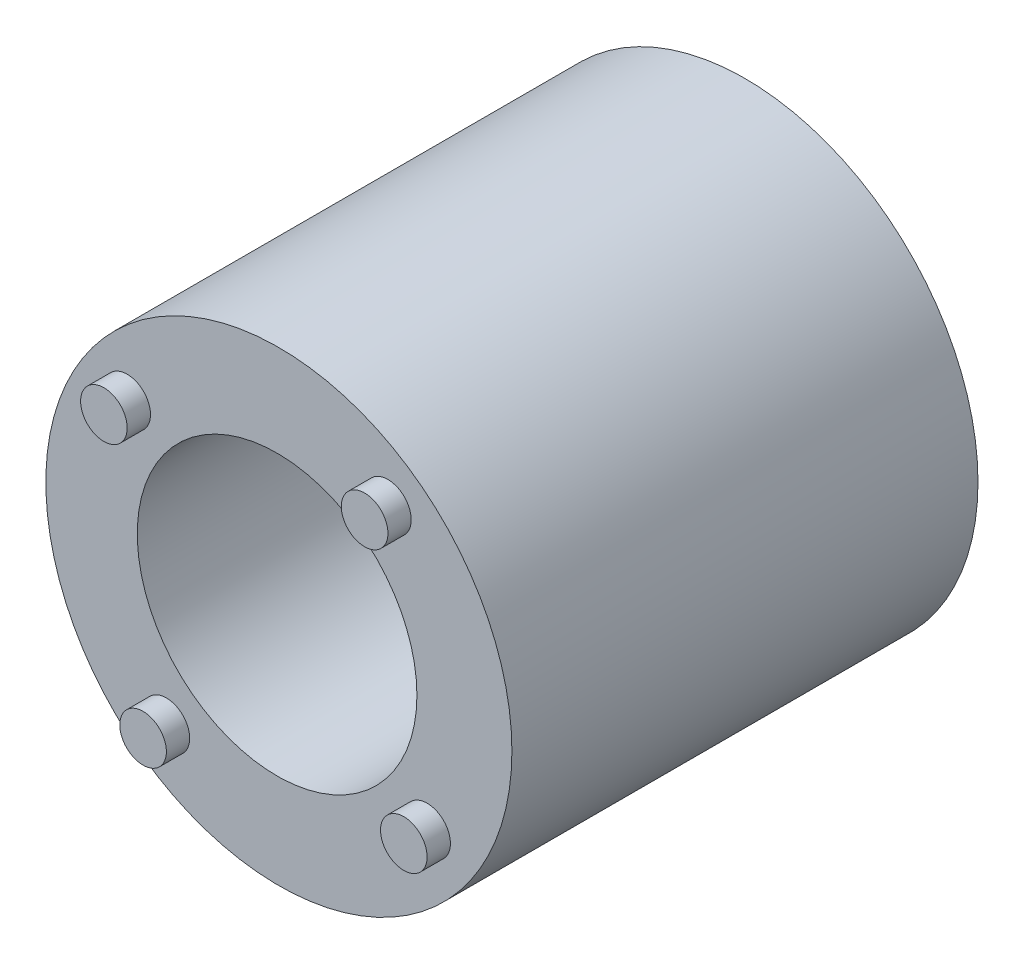
ISO-10303-21;
HEADER;
FILE_DESCRIPTION(('STEP AP214'),'2;1');
FILE_NAME('part.step','',(''),(''),'','','');
FILE_SCHEMA(('AUTOMOTIVE_DESIGN { 1 0 10303 214 1 1 1 1 }'));
ENDSEC;
DATA;
#1=APPLICATION_CONTEXT('core data for automotive mechanical design processes');
#2=APPLICATION_PROTOCOL_DEFINITION('international standard','automotive_design',2000,#1);
#3=PRODUCT_CONTEXT('',#1,'mechanical');
#4=PRODUCT('Part','Part','',(#3));
#5=PRODUCT_RELATED_PRODUCT_CATEGORY('part','',(#4));
#6=PRODUCT_DEFINITION_FORMATION('','',#4);
#7=PRODUCT_DEFINITION_CONTEXT('part definition',#1,'design');
#8=PRODUCT_DEFINITION('design','',#6,#7);
#9=PRODUCT_DEFINITION_SHAPE('','',#8);
#10=(LENGTH_UNIT() NAMED_UNIT(*) SI_UNIT(.MILLI.,.METRE.));
#11=(NAMED_UNIT(*) PLANE_ANGLE_UNIT() SI_UNIT($,.RADIAN.));
#12=(NAMED_UNIT(*) SI_UNIT($,.STERADIAN.) SOLID_ANGLE_UNIT());
#13=UNCERTAINTY_MEASURE_WITH_UNIT(LENGTH_MEASURE(1.E-05),#10,'distance_accuracy_value','');
#14=(GEOMETRIC_REPRESENTATION_CONTEXT(3) GLOBAL_UNCERTAINTY_ASSIGNED_CONTEXT((#13)) GLOBAL_UNIT_ASSIGNED_CONTEXT((#10,
#11,#12)) REPRESENTATION_CONTEXT('',''));
#15=CARTESIAN_POINT('',(0.,0.,0.));
#16=DIRECTION('',(0.,0.,1.));
#17=DIRECTION('',(1.,0.,0.));
#18=AXIS2_PLACEMENT_3D('',#15,#16,#17);
#19=CARTESIAN_POINT('',(0.369408827853465,0.,100.));
#20=DIRECTION('',(0.,0.,-1.));
#21=DIRECTION('',(-1.,0.,0.));
#22=AXIS2_PLACEMENT_3D('',#19,#20,#21);
#23=CYLINDRICAL_SURFACE('',#22,50.);
#24=CARTESIAN_POINT('',(0.369408827853465,0.,100.));
#25=DIRECTION('',(0.,0.,1.));
#26=DIRECTION('',(1.,0.,0.));
#27=AXIS2_PLACEMENT_3D('',#24,#25,#26);
#28=CIRCLE('',#27,50.);
#29=CARTESIAN_POINT('',(50.3694088278535,0.,100.));
#30=VERTEX_POINT('',#29);
#31=EDGE_CURVE('E107',#30,#30,#28,.T.);
#32=ORIENTED_EDGE('',*,*,#31,.F.);
#33=EDGE_LOOP('',(#32));
#34=FACE_BOUND('',#33,.T.);
#35=CARTESIAN_POINT('',(0.369408827853465,0.,0.));
#36=DIRECTION('',(0.,0.,1.));
#37=DIRECTION('',(1.,0.,0.));
#38=AXIS2_PLACEMENT_3D('',#35,#36,#37);
#39=CIRCLE('',#38,50.);
#40=CARTESIAN_POINT('',(50.3694088278535,0.,0.));
#41=VERTEX_POINT('',#40);
#42=EDGE_CURVE('E101',#41,#41,#39,.T.);
#43=ORIENTED_EDGE('',*,*,#42,.T.);
#44=EDGE_LOOP('',(#43));
#45=FACE_BOUND('',#44,.T.);
#46=ADVANCED_FACE('F45',(#34,#45),#23,.T.);
#47=CARTESIAN_POINT('',(0.369408827853465,0.,100.));
#48=DIRECTION('',(0.,0.,1.));
#49=DIRECTION('',(1.,0.,0.));
#50=AXIS2_PLACEMENT_3D('',#47,#48,#49);
#51=PLANE('',#50);
#52=CARTESIAN_POINT('',(-0.0094746881855734,0.189441758019856,100.));
#53=DIRECTION('',(0.,0.,1.));
#54=DIRECTION('',(1.,0.,0.));
#55=AXIS2_PLACEMENT_3D('',#52,#53,#54);
#56=CIRCLE('',#55,30.);
#57=CARTESIAN_POINT('',(29.9905253118144,0.189441758019856,100.));
#58=VERTEX_POINT('',#57);
#59=EDGE_CURVE('E267',#58,#58,#56,.T.);
#60=ORIENTED_EDGE('',*,*,#59,.F.);
#61=EDGE_LOOP('',(#60));
#62=FACE_BOUND('',#61,.T.);
#63=CARTESIAN_POINT('',(-32.1750319584208,23.7648336513134,100.));
#64=DIRECTION('',(0.,0.,1.));
#65=DIRECTION('',(1.,0.,0.));
#66=AXIS2_PLACEMENT_3D('',#63,#64,#65);
#67=CIRCLE('',#66,5.);
#68=CARTESIAN_POINT('',(-27.1750319584208,23.7648336513134,100.));
#69=VERTEX_POINT('',#68);
#70=EDGE_CURVE('E159',#69,#69,#67,.T.);
#71=ORIENTED_EDGE('',*,*,#70,.F.);
#72=EDGE_LOOP('',(#71));
#73=FACE_BOUND('',#72,.T.);
#74=CARTESIAN_POINT('',(-23.7648336513133,-32.1750319584209,100.));
#75=DIRECTION('',(0.,0.,1.));
#76=DIRECTION('',(1.,0.,0.));
#77=AXIS2_PLACEMENT_3D('',#74,#75,#76);
#78=CIRCLE('',#77,5.);
#79=CARTESIAN_POINT('',(-18.7648336513133,-32.1750319584209,100.));
#80=VERTEX_POINT('',#79);
#81=EDGE_CURVE('E170',#80,#80,#78,.T.);
#82=ORIENTED_EDGE('',*,*,#81,.F.);
#83=EDGE_LOOP('',(#82));
#84=FACE_BOUND('',#83,.T.);
#85=CARTESIAN_POINT('',(32.175031958421,-23.7648336513132,100.));
#86=DIRECTION('',(0.,0.,1.));
#87=DIRECTION('',(1.,0.,0.));
#88=AXIS2_PLACEMENT_3D('',#85,#86,#87);
#89=CIRCLE('',#88,5.);
#90=CARTESIAN_POINT('',(37.175031958421,-23.7648336513132,100.));
#91=VERTEX_POINT('',#90);
#92=EDGE_CURVE('E162',#91,#91,#89,.T.);
#93=ORIENTED_EDGE('',*,*,#92,.F.);
#94=EDGE_LOOP('',(#93));
#95=FACE_BOUND('',#94,.T.);
#96=CARTESIAN_POINT('',(23.7648336513131,32.1750319584211,100.));
#97=DIRECTION('',(0.,0.,1.));
#98=DIRECTION('',(1.,0.,0.));
#99=AXIS2_PLACEMENT_3D('',#96,#97,#98);
#100=CIRCLE('',#99,5.);
#101=CARTESIAN_POINT('',(28.7648336513131,32.1750319584211,100.));
#102=VERTEX_POINT('',#101);
#103=EDGE_CURVE('E113',#102,#102,#100,.T.);
#104=ORIENTED_EDGE('',*,*,#103,.F.);
#105=EDGE_LOOP('',(#104));
#106=FACE_BOUND('',#105,.T.);
#107=ORIENTED_EDGE('',*,*,#31,.T.);
#108=EDGE_LOOP('',(#107));
#109=FACE_BOUND('',#108,.T.);
#110=ADVANCED_FACE('F190',(#62,#73,#84,#95,#106,#109),#51,.T.);
#111=CARTESIAN_POINT('',(0.369408827853465,0.,0.));
#112=DIRECTION('',(0.,0.,1.));
#113=DIRECTION('',(1.,0.,0.));
#114=AXIS2_PLACEMENT_3D('',#111,#112,#113);
#115=PLANE('',#114);
#116=CARTESIAN_POINT('',(0.,35.,0.));
#117=DIRECTION('',(0.,0.,1.));
#118=DIRECTION('',(1.,0.,0.));
#119=AXIS2_PLACEMENT_3D('',#116,#117,#118);
#120=CIRCLE('',#119,5.);
#121=CARTESIAN_POINT('',(-1.26661145957513,30.1630903036678,0.));
#122=VERTEX_POINT('',#121);
#123=CARTESIAN_POINT('',(1.26397826571553,30.1624015313589,0.));
#124=VERTEX_POINT('',#123);
#125=EDGE_CURVE('E11',#122,#124,#120,.F.);
#126=ORIENTED_EDGE('',*,*,#125,.F.);
#127=CARTESIAN_POINT('',(-0.0094746881855734,0.189441758019856,0.));
#128=DIRECTION('',(0.,0.,1.));
#129=DIRECTION('',(1.,0.,0.));
#130=AXIS2_PLACEMENT_3D('',#127,#128,#129);
#131=CIRCLE('',#130,30.);
#132=CARTESIAN_POINT('',(-30.0092556183866,0.304089653546346,0.));
#133=VERTEX_POINT('',#132);
#134=EDGE_CURVE('E146',#122,#133,#131,.T.);
#135=ORIENTED_EDGE('',*,*,#134,.T.);
#136=CARTESIAN_POINT('',(-35.,-1.2220184685951E-13,0.));
#137=DIRECTION('',(0.,0.,1.));
#138=DIRECTION('',(1.,0.,0.));
#139=AXIS2_PLACEMENT_3D('',#136,#137,#138);
#140=CIRCLE('',#139,5.);
#141=CARTESIAN_POINT('',(-30.006255551278,-0.250032759570468,0.));
#142=VERTEX_POINT('',#141);
#143=EDGE_CURVE('E53',#142,#133,#140,.F.);
#144=ORIENTED_EDGE('',*,*,#143,.F.);
#145=EDGE_CURVE('E67',#142,#124,#131,.T.);
#146=ORIENTED_EDGE('',*,*,#145,.T.);
#147=EDGE_LOOP('',(#126,#135,#144,#146));
#148=FACE_BOUND('',#147,.T.);
#149=CARTESIAN_POINT('',(2.44403693719019E-13,-35.,0.));
#150=DIRECTION('',(0.,0.,1.));
#151=DIRECTION('',(1.,0.,0.));
#152=AXIS2_PLACEMENT_3D('',#149,#150,#151);
#153=CIRCLE('',#152,5.);
#154=CARTESIAN_POINT('',(5.00000000000024,-35.,0.));
#155=VERTEX_POINT('',#154);
#156=EDGE_CURVE('E131',#155,#155,#153,.F.);
#157=ORIENTED_EDGE('',*,*,#156,.F.);
#158=EDGE_LOOP('',(#157));
#159=FACE_BOUND('',#158,.T.);
#160=CARTESIAN_POINT('',(35.,3.66605540578529E-13,0.));
#161=DIRECTION('',(0.,0.,1.));
#162=DIRECTION('',(1.,0.,0.));
#163=AXIS2_PLACEMENT_3D('',#160,#161,#162);
#164=CIRCLE('',#163,5.);
#165=CARTESIAN_POINT('',(40.,3.66605540578529E-13,0.));
#166=VERTEX_POINT('',#165);
#167=EDGE_CURVE('E126',#166,#166,#164,.F.);
#168=ORIENTED_EDGE('',*,*,#167,.F.);
#169=EDGE_LOOP('',(#168));
#170=FACE_BOUND('',#169,.T.);
#171=ORIENTED_EDGE('',*,*,#42,.F.);
#172=EDGE_LOOP('',(#171));
#173=FACE_BOUND('',#172,.T.);
#174=ADVANCED_FACE('F144',(#148,#159,#170,#173),#115,.F.);
#175=CARTESIAN_POINT('',(35.,3.66605540578529E-13,-5.));
#176=DIRECTION('',(0.,0.,1.));
#177=DIRECTION('',(1.,0.,0.));
#178=AXIS2_PLACEMENT_3D('',#175,#176,#177);
#179=CYLINDRICAL_SURFACE('',#178,5.);
#180=CARTESIAN_POINT('',(35.,3.66605540578529E-13,-5.));
#181=DIRECTION('',(0.,0.,-1.));
#182=DIRECTION('',(-1.,0.,0.));
#183=AXIS2_PLACEMENT_3D('',#180,#181,#182);
#184=CIRCLE('',#183,5.);
#185=CARTESIAN_POINT('',(30.,3.66605540578529E-13,-5.));
#186=VERTEX_POINT('',#185);
#187=EDGE_CURVE('E119',#186,#186,#184,.T.);
#188=ORIENTED_EDGE('',*,*,#187,.F.);
#189=EDGE_LOOP('',(#188));
#190=FACE_BOUND('',#189,.T.);
#191=ORIENTED_EDGE('',*,*,#167,.T.);
#192=EDGE_LOOP('',(#191));
#193=FACE_BOUND('',#192,.T.);
#194=ADVANCED_FACE('F202',(#190,#193),#179,.T.);
#195=CARTESIAN_POINT('',(35.,3.66605540578529E-13,-5.));
#196=DIRECTION('',(0.,0.,-1.));
#197=DIRECTION('',(-1.,0.,0.));
#198=AXIS2_PLACEMENT_3D('',#195,#196,#197);
#199=PLANE('',#198);
#200=ORIENTED_EDGE('',*,*,#187,.T.);
#201=EDGE_LOOP('',(#200));
#202=FACE_BOUND('',#201,.T.);
#203=ADVANCED_FACE('F207',(#202),#199,.T.);
#204=CARTESIAN_POINT('',(2.44403693719019E-13,-35.,-5.));
#205=DIRECTION('',(0.,0.,1.));
#206=DIRECTION('',(1.,0.,0.));
#207=AXIS2_PLACEMENT_3D('',#204,#205,#206);
#208=CYLINDRICAL_SURFACE('',#207,5.);
#209=CARTESIAN_POINT('',(2.44403693719019E-13,-35.,-5.));
#210=DIRECTION('',(0.,0.,-1.));
#211=DIRECTION('',(-1.,0.,0.));
#212=AXIS2_PLACEMENT_3D('',#209,#210,#211);
#213=CIRCLE('',#212,5.);
#214=CARTESIAN_POINT('',(-4.99999999999975,-35.,-5.));
#215=VERTEX_POINT('',#214);
#216=EDGE_CURVE('E110',#215,#215,#213,.T.);
#217=ORIENTED_EDGE('',*,*,#216,.F.);
#218=EDGE_LOOP('',(#217));
#219=FACE_BOUND('',#218,.T.);
#220=ORIENTED_EDGE('',*,*,#156,.T.);
#221=EDGE_LOOP('',(#220));
#222=FACE_BOUND('',#221,.T.);
#223=ADVANCED_FACE('F212',(#219,#222),#208,.T.);
#224=CARTESIAN_POINT('',(2.44403693719019E-13,-35.,-5.));
#225=DIRECTION('',(0.,0.,-1.));
#226=DIRECTION('',(-1.,0.,0.));
#227=AXIS2_PLACEMENT_3D('',#224,#225,#226);
#228=PLANE('',#227);
#229=ORIENTED_EDGE('',*,*,#216,.T.);
#230=EDGE_LOOP('',(#229));
#231=FACE_BOUND('',#230,.T.);
#232=ADVANCED_FACE('F215',(#231),#228,.T.);
#233=CARTESIAN_POINT('',(-35.,-1.2220184685951E-13,-5.));
#234=DIRECTION('',(0.,0.,1.));
#235=DIRECTION('',(1.,0.,0.));
#236=AXIS2_PLACEMENT_3D('',#233,#234,#235);
#237=CYLINDRICAL_SURFACE('',#236,5.);
#238=ORIENTED_EDGE('',*,*,#143,.T.);
#239=DIRECTION('',(0.,0.,1.));
#240=VECTOR('',#239,1.);
#241=CARTESIAN_POINT('',(-30.0092556183866,0.304089653546346,47.5));
#242=LINE('',#241,#240);
#243=CARTESIAN_POINT('',(-30.0092556183866,0.304089653546346,-5.));
#244=VERTEX_POINT('',#243);
#245=EDGE_CURVE('E97',#133,#244,#242,.F.);
#246=ORIENTED_EDGE('',*,*,#245,.T.);
#247=CARTESIAN_POINT('',(-35.,-1.2220184685951E-13,-5.));
#248=DIRECTION('',(0.,0.,-1.));
#249=DIRECTION('',(-1.,0.,0.));
#250=AXIS2_PLACEMENT_3D('',#247,#248,#249);
#251=CIRCLE('',#250,5.);
#252=CARTESIAN_POINT('',(-30.006255551278,-0.250032759570468,-5.));
#253=VERTEX_POINT('',#252);
#254=EDGE_CURVE('E102',#253,#244,#251,.T.);
#255=ORIENTED_EDGE('',*,*,#254,.F.);
#256=DIRECTION('',(0.,0.,1.));
#257=VECTOR('',#256,1.);
#258=CARTESIAN_POINT('',(-30.006255551278,-0.250032759570468,47.5));
#259=LINE('',#258,#257);
#260=EDGE_CURVE('E141',#253,#142,#259,.T.);
#261=ORIENTED_EDGE('',*,*,#260,.T.);
#262=EDGE_LOOP('',(#238,#246,#255,#261));
#263=FACE_BOUND('',#262,.T.);
#264=ADVANCED_FACE('F139',(#263),#237,.T.);
#265=CARTESIAN_POINT('',(-35.,-1.2220184685951E-13,-5.));
#266=DIRECTION('',(0.,0.,-1.));
#267=DIRECTION('',(-1.,0.,0.));
#268=AXIS2_PLACEMENT_3D('',#265,#266,#267);
#269=PLANE('',#268);
#270=CARTESIAN_POINT('',(-0.0094746881855734,0.189441758019856,-5.));
#271=DIRECTION('',(0.,0.,1.));
#272=DIRECTION('',(1.,0.,0.));
#273=AXIS2_PLACEMENT_3D('',#270,#271,#272);
#274=CIRCLE('',#273,30.);
#275=EDGE_CURVE('E90',#244,#253,#274,.T.);
#276=ORIENTED_EDGE('',*,*,#275,.T.);
#277=ORIENTED_EDGE('',*,*,#254,.T.);
#278=EDGE_LOOP('',(#276,#277));
#279=FACE_BOUND('',#278,.T.);
#280=ADVANCED_FACE('F222',(#279),#269,.T.);
#281=CARTESIAN_POINT('',(0.,35.,-5.));
#282=DIRECTION('',(0.,0.,1.));
#283=DIRECTION('',(1.,0.,0.));
#284=AXIS2_PLACEMENT_3D('',#281,#282,#283);
#285=CYLINDRICAL_SURFACE('',#284,5.);
#286=ORIENTED_EDGE('',*,*,#125,.T.);
#287=DIRECTION('',(0.,0.,1.));
#288=VECTOR('',#287,1.);
#289=CARTESIAN_POINT('',(1.26397826571553,30.1624015313589,47.5));
#290=LINE('',#289,#288);
#291=CARTESIAN_POINT('',(1.26397826571553,30.1624015313589,-5.));
#292=VERTEX_POINT('',#291);
#293=EDGE_CURVE('E85',#124,#292,#290,.F.);
#294=ORIENTED_EDGE('',*,*,#293,.T.);
#295=CARTESIAN_POINT('',(0.,35.,-5.));
#296=DIRECTION('',(0.,0.,-1.));
#297=DIRECTION('',(-1.,0.,0.));
#298=AXIS2_PLACEMENT_3D('',#295,#296,#297);
#299=CIRCLE('',#298,5.);
#300=CARTESIAN_POINT('',(-1.26661145957513,30.1630903036678,-5.));
#301=VERTEX_POINT('',#300);
#302=EDGE_CURVE('E94',#301,#292,#299,.T.);
#303=ORIENTED_EDGE('',*,*,#302,.F.);
#304=DIRECTION('',(0.,0.,1.));
#305=VECTOR('',#304,1.);
#306=CARTESIAN_POINT('',(-1.26661145957513,30.1630903036678,47.5));
#307=LINE('',#306,#305);
#308=EDGE_CURVE('E60',#301,#122,#307,.T.);
#309=ORIENTED_EDGE('',*,*,#308,.T.);
#310=EDGE_LOOP('',(#286,#294,#303,#309));
#311=FACE_BOUND('',#310,.T.);
#312=ADVANCED_FACE('F93',(#311),#285,.T.);
#313=CARTESIAN_POINT('',(0.,35.,-5.));
#314=DIRECTION('',(0.,0.,-1.));
#315=DIRECTION('',(-1.,0.,0.));
#316=AXIS2_PLACEMENT_3D('',#313,#314,#315);
#317=PLANE('',#316);
#318=EDGE_CURVE('E82',#292,#301,#274,.T.);
#319=ORIENTED_EDGE('',*,*,#318,.T.);
#320=ORIENTED_EDGE('',*,*,#302,.T.);
#321=EDGE_LOOP('',(#319,#320));
#322=FACE_BOUND('',#321,.T.);
#323=ADVANCED_FACE('F99',(#322),#317,.T.);
#324=CARTESIAN_POINT('',(23.7648336513131,32.1750319584211,105.));
#325=DIRECTION('',(0.,0.,-1.));
#326=DIRECTION('',(-1.,0.,0.));
#327=AXIS2_PLACEMENT_3D('',#324,#325,#326);
#328=CYLINDRICAL_SURFACE('',#327,5.);
#329=CARTESIAN_POINT('',(23.7648336513131,32.1750319584211,105.));
#330=DIRECTION('',(0.,0.,1.));
#331=DIRECTION('',(1.,0.,0.));
#332=AXIS2_PLACEMENT_3D('',#329,#330,#331);
#333=CIRCLE('',#332,5.);
#334=CARTESIAN_POINT('',(28.7648336513131,32.1750319584211,105.));
#335=VERTEX_POINT('',#334);
#336=EDGE_CURVE('E123',#335,#335,#333,.T.);
#337=ORIENTED_EDGE('',*,*,#336,.F.);
#338=EDGE_LOOP('',(#337));
#339=FACE_BOUND('',#338,.T.);
#340=ORIENTED_EDGE('',*,*,#103,.T.);
#341=EDGE_LOOP('',(#340));
#342=FACE_BOUND('',#341,.T.);
#343=ADVANCED_FACE('F188',(#339,#342),#328,.T.);
#344=CARTESIAN_POINT('',(23.7648336513131,32.1750319584211,105.));
#345=DIRECTION('',(0.,0.,1.));
#346=DIRECTION('',(1.,0.,0.));
#347=AXIS2_PLACEMENT_3D('',#344,#345,#346);
#348=PLANE('',#347);
#349=ORIENTED_EDGE('',*,*,#336,.T.);
#350=EDGE_LOOP('',(#349));
#351=FACE_BOUND('',#350,.T.);
#352=ADVANCED_FACE('F233',(#351),#348,.T.);
#353=CARTESIAN_POINT('',(32.175031958421,-23.7648336513132,105.));
#354=DIRECTION('',(0.,0.,-1.));
#355=DIRECTION('',(-1.,0.,0.));
#356=AXIS2_PLACEMENT_3D('',#353,#354,#355);
#357=CYLINDRICAL_SURFACE('',#356,5.);
#358=CARTESIAN_POINT('',(32.175031958421,-23.7648336513132,105.));
#359=DIRECTION('',(0.,0.,1.));
#360=DIRECTION('',(1.,0.,0.));
#361=AXIS2_PLACEMENT_3D('',#358,#359,#360);
#362=CIRCLE('',#361,5.);
#363=CARTESIAN_POINT('',(37.175031958421,-23.7648336513132,105.));
#364=VERTEX_POINT('',#363);
#365=EDGE_CURVE('E166',#364,#364,#362,.T.);
#366=ORIENTED_EDGE('',*,*,#365,.F.);
#367=EDGE_LOOP('',(#366));
#368=FACE_BOUND('',#367,.T.);
#369=ORIENTED_EDGE('',*,*,#92,.T.);
#370=EDGE_LOOP('',(#369));
#371=FACE_BOUND('',#370,.T.);
#372=ADVANCED_FACE('F237',(#368,#371),#357,.T.);
#373=CARTESIAN_POINT('',(32.175031958421,-23.7648336513132,105.));
#374=DIRECTION('',(0.,0.,1.));
#375=DIRECTION('',(1.,0.,0.));
#376=AXIS2_PLACEMENT_3D('',#373,#374,#375);
#377=PLANE('',#376);
#378=ORIENTED_EDGE('',*,*,#365,.T.);
#379=EDGE_LOOP('',(#378));
#380=FACE_BOUND('',#379,.T.);
#381=ADVANCED_FACE('F253',(#380),#377,.T.);
#382=CARTESIAN_POINT('',(-23.7648336513133,-32.1750319584209,105.));
#383=DIRECTION('',(0.,0.,-1.));
#384=DIRECTION('',(-1.,0.,0.));
#385=AXIS2_PLACEMENT_3D('',#382,#383,#384);
#386=CYLINDRICAL_SURFACE('',#385,5.);
#387=CARTESIAN_POINT('',(-23.7648336513133,-32.1750319584209,105.));
#388=DIRECTION('',(0.,0.,1.));
#389=DIRECTION('',(1.,0.,0.));
#390=AXIS2_PLACEMENT_3D('',#387,#388,#389);
#391=CIRCLE('',#390,5.);
#392=CARTESIAN_POINT('',(-18.7648336513133,-32.1750319584209,105.));
#393=VERTEX_POINT('',#392);
#394=EDGE_CURVE('E174',#393,#393,#391,.T.);
#395=ORIENTED_EDGE('',*,*,#394,.F.);
#396=EDGE_LOOP('',(#395));
#397=FACE_BOUND('',#396,.T.);
#398=ORIENTED_EDGE('',*,*,#81,.T.);
#399=EDGE_LOOP('',(#398));
#400=FACE_BOUND('',#399,.T.);
#401=ADVANCED_FACE('F249',(#397,#400),#386,.T.);
#402=CARTESIAN_POINT('',(-23.7648336513133,-32.1750319584209,105.));
#403=DIRECTION('',(0.,0.,1.));
#404=DIRECTION('',(1.,0.,0.));
#405=AXIS2_PLACEMENT_3D('',#402,#403,#404);
#406=PLANE('',#405);
#407=ORIENTED_EDGE('',*,*,#394,.T.);
#408=EDGE_LOOP('',(#407));
#409=FACE_BOUND('',#408,.T.);
#410=ADVANCED_FACE('F245',(#409),#406,.T.);
#411=CARTESIAN_POINT('',(-32.1750319584208,23.7648336513134,105.));
#412=DIRECTION('',(0.,0.,-1.));
#413=DIRECTION('',(-1.,0.,0.));
#414=AXIS2_PLACEMENT_3D('',#411,#412,#413);
#415=CYLINDRICAL_SURFACE('',#414,5.);
#416=CARTESIAN_POINT('',(-32.1750319584208,23.7648336513134,105.));
#417=DIRECTION('',(0.,0.,1.));
#418=DIRECTION('',(1.,0.,0.));
#419=AXIS2_PLACEMENT_3D('',#416,#417,#418);
#420=CIRCLE('',#419,5.);
#421=CARTESIAN_POINT('',(-27.1750319584208,23.7648336513134,105.));
#422=VERTEX_POINT('',#421);
#423=EDGE_CURVE('E155',#422,#422,#420,.T.);
#424=ORIENTED_EDGE('',*,*,#423,.F.);
#425=EDGE_LOOP('',(#424));
#426=FACE_BOUND('',#425,.T.);
#427=ORIENTED_EDGE('',*,*,#70,.T.);
#428=EDGE_LOOP('',(#427));
#429=FACE_BOUND('',#428,.T.);
#430=ADVANCED_FACE('F241',(#426,#429),#415,.T.);
#431=CARTESIAN_POINT('',(-32.1750319584208,23.7648336513134,105.));
#432=DIRECTION('',(0.,0.,1.));
#433=DIRECTION('',(1.,0.,0.));
#434=AXIS2_PLACEMENT_3D('',#431,#432,#433);
#435=PLANE('',#434);
#436=ORIENTED_EDGE('',*,*,#423,.T.);
#437=EDGE_LOOP('',(#436));
#438=FACE_BOUND('',#437,.T.);
#439=ADVANCED_FACE('F238',(#438),#435,.T.);
#440=CARTESIAN_POINT('',(-0.0094746881855734,0.189441758019856,-5.));
#441=DIRECTION('',(0.,0.,1.));
#442=DIRECTION('',(1.,0.,0.));
#443=AXIS2_PLACEMENT_3D('',#440,#441,#442);
#444=CYLINDRICAL_SURFACE('',#443,30.);
#445=ORIENTED_EDGE('',*,*,#59,.T.);
#446=EDGE_LOOP('',(#445));
#447=FACE_BOUND('',#446,.T.);
#448=ORIENTED_EDGE('',*,*,#275,.F.);
#449=ORIENTED_EDGE('',*,*,#245,.F.);
#450=ORIENTED_EDGE('',*,*,#134,.F.);
#451=ORIENTED_EDGE('',*,*,#308,.F.);
#452=ORIENTED_EDGE('',*,*,#318,.F.);
#453=ORIENTED_EDGE('',*,*,#293,.F.);
#454=ORIENTED_EDGE('',*,*,#145,.F.);
#455=ORIENTED_EDGE('',*,*,#260,.F.);
#456=EDGE_LOOP('',(#448,#449,#450,#451,#452,#453,#454,#455));
#457=FACE_BOUND('',#456,.T.);
#458=ADVANCED_FACE('F84',(#447,#457),#444,.F.);
#459=CLOSED_SHELL('',(#46,#110,#174,#194,#203,#223,#232,#264,#280,#312,#323,#343,#352,#372,#381,
#401,#410,#430,#439,#458));
#460=MANIFOLD_SOLID_BREP('B2',#459);
#461=ADVANCED_BREP_SHAPE_REPRESENTATION('',(#18,#460),#14);
#462=SHAPE_DEFINITION_REPRESENTATION(#9,#461);
ENDSEC;
END-ISO-10303-21;
